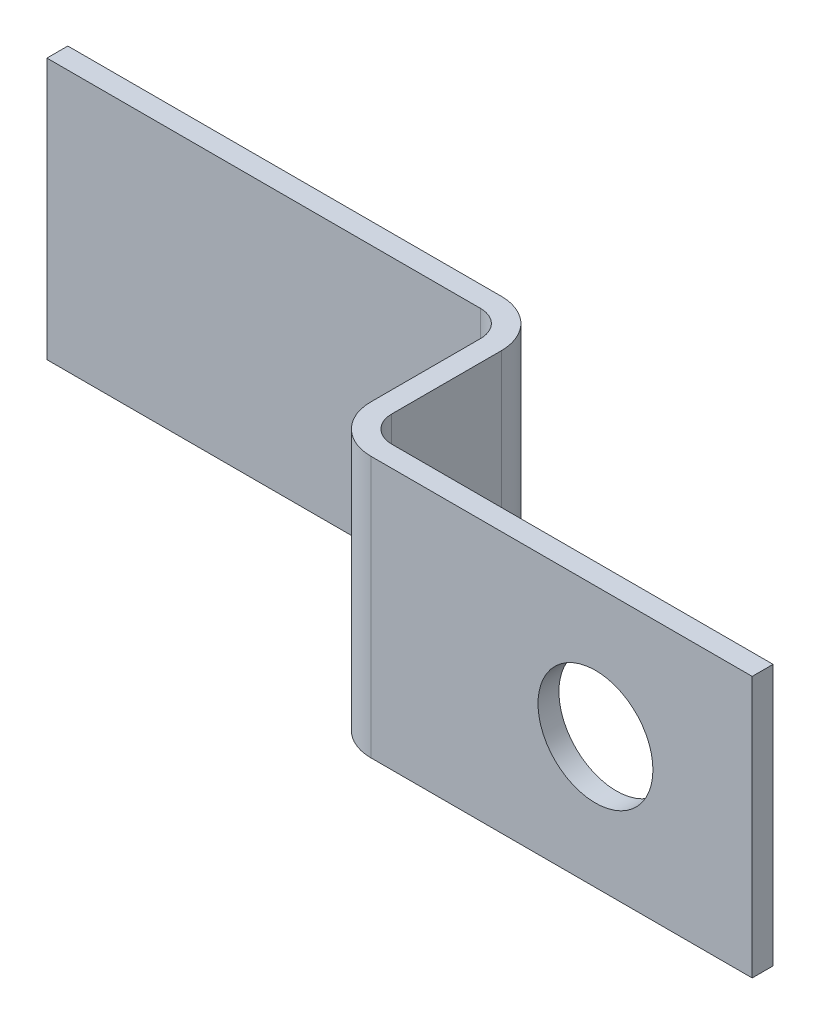
ISO-10303-21;
HEADER;
FILE_DESCRIPTION(('STEP AP214'),'2;1');
FILE_NAME('part.step','',(''),(''),'','','');
FILE_SCHEMA(('AUTOMOTIVE_DESIGN { 1 0 10303 214 1 1 1 1 }'));
ENDSEC;
DATA;
#1=APPLICATION_CONTEXT('core data for automotive mechanical design processes');
#2=APPLICATION_PROTOCOL_DEFINITION('international standard','automotive_design',2000,#1);
#3=PRODUCT_CONTEXT('',#1,'mechanical');
#4=PRODUCT('Part','Part','',(#3));
#5=PRODUCT_RELATED_PRODUCT_CATEGORY('part','',(#4));
#6=PRODUCT_DEFINITION_FORMATION('','',#4);
#7=PRODUCT_DEFINITION_CONTEXT('part definition',#1,'design');
#8=PRODUCT_DEFINITION('design','',#6,#7);
#9=PRODUCT_DEFINITION_SHAPE('','',#8);
#10=(LENGTH_UNIT() NAMED_UNIT(*) SI_UNIT(.MILLI.,.METRE.));
#11=(NAMED_UNIT(*) PLANE_ANGLE_UNIT() SI_UNIT($,.RADIAN.));
#12=(NAMED_UNIT(*) SI_UNIT($,.STERADIAN.) SOLID_ANGLE_UNIT());
#13=UNCERTAINTY_MEASURE_WITH_UNIT(LENGTH_MEASURE(1.E-05),#10,'distance_accuracy_value','');
#14=(GEOMETRIC_REPRESENTATION_CONTEXT(3) GLOBAL_UNCERTAINTY_ASSIGNED_CONTEXT((#13)) GLOBAL_UNIT_ASSIGNED_CONTEXT((#10,
#11,#12)) REPRESENTATION_CONTEXT('',''));
#15=CARTESIAN_POINT('',(0.,0.,0.));
#16=DIRECTION('',(0.,0.,1.));
#17=DIRECTION('',(1.,0.,0.));
#18=AXIS2_PLACEMENT_3D('',#15,#16,#17);
#19=CARTESIAN_POINT('',(-27.4626472495789,-5.,-3.31523835920205));
#20=DIRECTION('',(1.,0.,0.));
#21=DIRECTION('',(0.,0.,-1.));
#22=AXIS2_PLACEMENT_3D('',#19,#20,#21);
#23=PLANE('',#22);
#24=DIRECTION('',(0.,1.,0.));
#25=VECTOR('',#24,1.);
#26=CARTESIAN_POINT('',(-27.4626472495789,-5.,3.68476164079796));
#27=LINE('',#26,#25);
#28=CARTESIAN_POINT('',(-27.4626472495789,-5.,3.68476164079796));
#29=VERTEX_POINT('',#28);
#30=CARTESIAN_POINT('',(-27.4626472495789,5.,3.68476164079796));
#31=VERTEX_POINT('',#30);
#32=EDGE_CURVE('E210',#29,#31,#27,.T.);
#33=ORIENTED_EDGE('',*,*,#32,.T.);
#34=DIRECTION('',(0.,0.,1.));
#35=VECTOR('',#34,1.);
#36=CARTESIAN_POINT('',(-27.4626472495789,5.,-3.31523835920205));
#37=LINE('',#36,#35);
#38=CARTESIAN_POINT('',(-27.4626472495789,5.,4.48476164079796));
#39=VERTEX_POINT('',#38);
#40=EDGE_CURVE('E151',#31,#39,#37,.T.);
#41=ORIENTED_EDGE('',*,*,#40,.T.);
#42=DIRECTION('',(0.,1.,0.));
#43=VECTOR('',#42,1.);
#44=CARTESIAN_POINT('',(-27.4626472495789,-5.,4.48476164079796));
#45=LINE('',#44,#43);
#46=CARTESIAN_POINT('',(-27.4626472495789,-5.,4.48476164079796));
#47=VERTEX_POINT('',#46);
#48=EDGE_CURVE('E215',#47,#39,#45,.T.);
#49=ORIENTED_EDGE('',*,*,#48,.F.);
#50=DIRECTION('',(0.,0.,1.));
#51=VECTOR('',#50,1.);
#52=CARTESIAN_POINT('',(-27.4626472495789,-5.,-3.31523835920205));
#53=LINE('',#52,#51);
#54=EDGE_CURVE('E145',#29,#47,#53,.T.);
#55=ORIENTED_EDGE('',*,*,#54,.F.);
#56=EDGE_LOOP('',(#33,#41,#49,#55));
#57=FACE_BOUND('',#56,.T.);
#58=ADVANCED_FACE('F30',(#57),#23,.T.);
#59=CARTESIAN_POINT('',(-61.4626472495789,-5.,-3.31523835920205));
#60=DIRECTION('',(0.,-1.,0.));
#61=DIRECTION('',(0.,0.,-1.));
#62=AXIS2_PLACEMENT_3D('',#59,#60,#61);
#63=PLANE('',#62);
#64=DIRECTION('',(1.,0.,0.));
#65=VECTOR('',#64,1.);
#66=CARTESIAN_POINT('',(-61.4626472495789,-5.,4.48476164079796));
#67=LINE('',#66,#65);
#68=CARTESIAN_POINT('',(-42.0626472495789,-5.,4.48476164079796));
#69=VERTEX_POINT('',#68);
#70=EDGE_CURVE('E218',#69,#47,#67,.T.);
#71=ORIENTED_EDGE('',*,*,#70,.F.);
#72=CARTESIAN_POINT('',(-42.0626472495789,-5.,2.68476164079796));
#73=DIRECTION('',(0.,-1.,0.));
#74=DIRECTION('',(0.,0.,-1.));
#75=AXIS2_PLACEMENT_3D('',#72,#73,#74);
#76=CIRCLE('',#75,1.8);
#77=CARTESIAN_POINT('',(-43.8626472495789,-5.,2.68476164079796));
#78=VERTEX_POINT('',#77);
#79=EDGE_CURVE('E11',#69,#78,#76,.T.);
#80=ORIENTED_EDGE('',*,*,#79,.T.);
#81=DIRECTION('',(0.,0.,-1.));
#82=VECTOR('',#81,1.);
#83=CARTESIAN_POINT('',(-43.8626472495789,-5.,4.48476164079796));
#84=LINE('',#83,#82);
#85=CARTESIAN_POINT('',(-43.8626472495789,-5.,-1.51523835920204));
#86=VERTEX_POINT('',#85);
#87=EDGE_CURVE('E130',#78,#86,#84,.T.);
#88=ORIENTED_EDGE('',*,*,#87,.T.);
#89=CARTESIAN_POINT('',(-44.8626472495789,-5.,-1.51523835920204));
#90=DIRECTION('',(0.,-1.,0.));
#91=DIRECTION('',(0.,0.,-1.));
#92=AXIS2_PLACEMENT_3D('',#89,#90,#91);
#93=CIRCLE('',#92,1.);
#94=CARTESIAN_POINT('',(-44.8626472495789,-5.,-2.51523835920204));
#95=VERTEX_POINT('',#94);
#96=EDGE_CURVE('E125',#86,#95,#93,.F.);
#97=ORIENTED_EDGE('',*,*,#96,.T.);
#98=DIRECTION('',(-1.,0.,0.));
#99=VECTOR('',#98,1.);
#100=CARTESIAN_POINT('',(-43.8626472495789,-5.,-2.51523835920204));
#101=LINE('',#100,#99);
#102=CARTESIAN_POINT('',(-61.4626472495789,-5.,-2.51523835920204));
#103=VERTEX_POINT('',#102);
#104=EDGE_CURVE('E117',#95,#103,#101,.T.);
#105=ORIENTED_EDGE('',*,*,#104,.T.);
#106=DIRECTION('',(0.,0.,1.));
#107=VECTOR('',#106,1.);
#108=CARTESIAN_POINT('',(-61.4626472495789,-5.,-3.31523835920205));
#109=LINE('',#108,#107);
#110=CARTESIAN_POINT('',(-61.4626472495789,-5.,-3.31523835920205));
#111=VERTEX_POINT('',#110);
#112=EDGE_CURVE('E122',#111,#103,#109,.T.);
#113=ORIENTED_EDGE('',*,*,#112,.F.);
#114=DIRECTION('',(1.,0.,0.));
#115=VECTOR('',#114,1.);
#116=CARTESIAN_POINT('',(-61.4626472495789,-5.,-3.31523835920205));
#117=LINE('',#116,#115);
#118=CARTESIAN_POINT('',(-44.8626472495789,-5.,-3.31523835920205));
#119=VERTEX_POINT('',#118);
#120=EDGE_CURVE('E156',#111,#119,#117,.T.);
#121=ORIENTED_EDGE('',*,*,#120,.T.);
#122=CARTESIAN_POINT('',(-44.8626472495789,-5.,-1.51523835920205));
#123=DIRECTION('',(0.,-1.,0.));
#124=DIRECTION('',(0.,0.,-1.));
#125=AXIS2_PLACEMENT_3D('',#122,#123,#124);
#126=CIRCLE('',#125,1.8);
#127=CARTESIAN_POINT('',(-43.0626472495789,-5.,-1.51523835920205));
#128=VERTEX_POINT('',#127);
#129=EDGE_CURVE('E183',#119,#128,#126,.T.);
#130=ORIENTED_EDGE('',*,*,#129,.T.);
#131=DIRECTION('',(0.,0.,1.));
#132=VECTOR('',#131,1.);
#133=CARTESIAN_POINT('',(-43.0626472495789,-5.,-3.31523835920204));
#134=LINE('',#133,#132);
#135=CARTESIAN_POINT('',(-43.0626472495789,-5.,2.68476164079796));
#136=VERTEX_POINT('',#135);
#137=EDGE_CURVE('E205',#128,#136,#134,.T.);
#138=ORIENTED_EDGE('',*,*,#137,.T.);
#139=CARTESIAN_POINT('',(-42.0626472495789,-5.,2.68476164079796));
#140=DIRECTION('',(0.,-1.,0.));
#141=DIRECTION('',(0.,0.,-1.));
#142=AXIS2_PLACEMENT_3D('',#139,#140,#141);
#143=CIRCLE('',#142,1.);
#144=CARTESIAN_POINT('',(-42.0626472495789,-5.,3.68476164079796));
#145=VERTEX_POINT('',#144);
#146=EDGE_CURVE('E165',#136,#145,#143,.F.);
#147=ORIENTED_EDGE('',*,*,#146,.T.);
#148=DIRECTION('',(1.,0.,0.));
#149=VECTOR('',#148,1.);
#150=CARTESIAN_POINT('',(-43.0626472495789,-5.,3.68476164079796));
#151=LINE('',#150,#149);
#152=EDGE_CURVE('E207',#145,#29,#151,.T.);
#153=ORIENTED_EDGE('',*,*,#152,.T.);
#154=ORIENTED_EDGE('',*,*,#54,.T.);
#155=EDGE_LOOP('',(#71,#80,#88,#97,#105,#113,#121,#130,#138,#147,#153,#154));
#156=FACE_BOUND('',#155,.T.);
#157=ADVANCED_FACE('F119',(#156),#63,.T.);
#158=CARTESIAN_POINT('',(-61.4626472495789,5.,-3.31523835920205));
#159=DIRECTION('',(-1.,0.,0.));
#160=DIRECTION('',(0.,0.,1.));
#161=AXIS2_PLACEMENT_3D('',#158,#159,#160);
#162=PLANE('',#161);
#163=DIRECTION('',(0.,1.,0.));
#164=VECTOR('',#163,1.);
#165=CARTESIAN_POINT('',(-61.4626472495789,-5.,-2.51523835920204));
#166=LINE('',#165,#164);
#167=CARTESIAN_POINT('',(-61.4626472495789,5.,-2.51523835920204));
#168=VERTEX_POINT('',#167);
#169=EDGE_CURVE('E129',#103,#168,#166,.T.);
#170=ORIENTED_EDGE('',*,*,#169,.T.);
#171=DIRECTION('',(0.,0.,1.));
#172=VECTOR('',#171,1.);
#173=CARTESIAN_POINT('',(-61.4626472495789,5.,-3.31523835920205));
#174=LINE('',#173,#172);
#175=CARTESIAN_POINT('',(-61.4626472495789,5.,-3.31523835920205));
#176=VERTEX_POINT('',#175);
#177=EDGE_CURVE('E146',#176,#168,#174,.T.);
#178=ORIENTED_EDGE('',*,*,#177,.F.);
#179=DIRECTION('',(0.,-1.,0.));
#180=VECTOR('',#179,1.);
#181=CARTESIAN_POINT('',(-61.4626472495789,5.,-3.31523835920205));
#182=LINE('',#181,#180);
#183=EDGE_CURVE('E143',#176,#111,#182,.T.);
#184=ORIENTED_EDGE('',*,*,#183,.T.);
#185=ORIENTED_EDGE('',*,*,#112,.T.);
#186=EDGE_LOOP('',(#170,#178,#184,#185));
#187=FACE_BOUND('',#186,.T.);
#188=ADVANCED_FACE('F141',(#187),#162,.T.);
#189=CARTESIAN_POINT('',(-27.4626472495789,5.,-3.31523835920205));
#190=DIRECTION('',(0.,1.,0.));
#191=DIRECTION('',(0.,0.,1.));
#192=AXIS2_PLACEMENT_3D('',#189,#190,#191);
#193=PLANE('',#192);
#194=DIRECTION('',(0.,0.,-1.));
#195=VECTOR('',#194,1.);
#196=CARTESIAN_POINT('',(-43.8626472495789,5.,4.48476164079796));
#197=LINE('',#196,#195);
#198=CARTESIAN_POINT('',(-43.8626472495789,5.,2.68476164079796));
#199=VERTEX_POINT('',#198);
#200=CARTESIAN_POINT('',(-43.8626472495789,5.,-1.51523835920204));
#201=VERTEX_POINT('',#200);
#202=EDGE_CURVE('E192',#199,#201,#197,.T.);
#203=ORIENTED_EDGE('',*,*,#202,.F.);
#204=CARTESIAN_POINT('',(-42.0626472495789,5.,2.68476164079796));
#205=DIRECTION('',(0.,1.,0.));
#206=DIRECTION('',(0.,0.,1.));
#207=AXIS2_PLACEMENT_3D('',#204,#205,#206);
#208=CIRCLE('',#207,1.8);
#209=CARTESIAN_POINT('',(-42.0626472495789,5.,4.48476164079796));
#210=VERTEX_POINT('',#209);
#211=EDGE_CURVE('E52',#199,#210,#208,.T.);
#212=ORIENTED_EDGE('',*,*,#211,.T.);
#213=DIRECTION('',(-1.,0.,0.));
#214=VECTOR('',#213,1.);
#215=CARTESIAN_POINT('',(-27.4626472495789,5.,4.48476164079796));
#216=LINE('',#215,#214);
#217=EDGE_CURVE('E223',#39,#210,#216,.T.);
#218=ORIENTED_EDGE('',*,*,#217,.F.);
#219=ORIENTED_EDGE('',*,*,#40,.F.);
#220=DIRECTION('',(1.,0.,0.));
#221=VECTOR('',#220,1.);
#222=CARTESIAN_POINT('',(-43.0626472495789,5.,3.68476164079796));
#223=LINE('',#222,#221);
#224=CARTESIAN_POINT('',(-42.0626472495789,5.,3.68476164079796));
#225=VERTEX_POINT('',#224);
#226=EDGE_CURVE('E208',#225,#31,#223,.T.);
#227=ORIENTED_EDGE('',*,*,#226,.F.);
#228=CARTESIAN_POINT('',(-42.0626472495789,5.,2.68476164079796));
#229=DIRECTION('',(0.,1.,0.));
#230=DIRECTION('',(0.,0.,1.));
#231=AXIS2_PLACEMENT_3D('',#228,#229,#230);
#232=CIRCLE('',#231,1.);
#233=CARTESIAN_POINT('',(-43.0626472495789,5.,2.68476164079796));
#234=VERTEX_POINT('',#233);
#235=EDGE_CURVE('E162',#225,#234,#232,.F.);
#236=ORIENTED_EDGE('',*,*,#235,.T.);
#237=DIRECTION('',(0.,0.,1.));
#238=VECTOR('',#237,1.);
#239=CARTESIAN_POINT('',(-43.0626472495789,5.,-3.31523835920204));
#240=LINE('',#239,#238);
#241=CARTESIAN_POINT('',(-43.0626472495789,5.,-1.51523835920205));
#242=VERTEX_POINT('',#241);
#243=EDGE_CURVE('E139',#242,#234,#240,.T.);
#244=ORIENTED_EDGE('',*,*,#243,.F.);
#245=CARTESIAN_POINT('',(-44.8626472495789,5.,-1.51523835920205));
#246=DIRECTION('',(0.,1.,0.));
#247=DIRECTION('',(0.,0.,1.));
#248=AXIS2_PLACEMENT_3D('',#245,#246,#247);
#249=CIRCLE('',#248,1.8);
#250=CARTESIAN_POINT('',(-44.8626472495789,5.,-3.31523835920205));
#251=VERTEX_POINT('',#250);
#252=EDGE_CURVE('E179',#242,#251,#249,.T.);
#253=ORIENTED_EDGE('',*,*,#252,.T.);
#254=DIRECTION('',(-1.,0.,0.));
#255=VECTOR('',#254,1.);
#256=CARTESIAN_POINT('',(-27.4626472495789,5.,-3.31523835920205));
#257=LINE('',#256,#255);
#258=EDGE_CURVE('E216',#251,#176,#257,.T.);
#259=ORIENTED_EDGE('',*,*,#258,.T.);
#260=ORIENTED_EDGE('',*,*,#177,.T.);
#261=DIRECTION('',(-1.,0.,0.));
#262=VECTOR('',#261,1.);
#263=CARTESIAN_POINT('',(-43.8626472495789,5.,-2.51523835920204));
#264=LINE('',#263,#262);
#265=CARTESIAN_POINT('',(-44.8626472495789,5.,-2.51523835920204));
#266=VERTEX_POINT('',#265);
#267=EDGE_CURVE('E135',#266,#168,#264,.T.);
#268=ORIENTED_EDGE('',*,*,#267,.F.);
#269=CARTESIAN_POINT('',(-44.8626472495789,5.,-1.51523835920204));
#270=DIRECTION('',(0.,1.,0.));
#271=DIRECTION('',(0.,0.,1.));
#272=AXIS2_PLACEMENT_3D('',#269,#270,#271);
#273=CIRCLE('',#272,1.);
#274=EDGE_CURVE('E172',#266,#201,#273,.F.);
#275=ORIENTED_EDGE('',*,*,#274,.T.);
#276=EDGE_LOOP('',(#203,#212,#218,#219,#227,#236,#244,#253,#259,#260,#268,#275));
#277=FACE_BOUND('',#276,.T.);
#278=ADVANCED_FACE('F195',(#277),#193,.T.);
#279=CARTESIAN_POINT('',(-27.4626472495789,5.,-3.31523835920205));
#280=DIRECTION('',(0.,0.,1.));
#281=DIRECTION('',(1.,0.,0.));
#282=AXIS2_PLACEMENT_3D('',#279,#280,#281);
#283=PLANE('',#282);
#284=ORIENTED_EDGE('',*,*,#258,.F.);
#285=DIRECTION('',(0.,1.,0.));
#286=VECTOR('',#285,1.);
#287=CARTESIAN_POINT('',(-44.8626472495789,5.,-3.31523835920205));
#288=LINE('',#287,#286);
#289=EDGE_CURVE('E181',#251,#119,#288,.F.);
#290=ORIENTED_EDGE('',*,*,#289,.T.);
#291=ORIENTED_EDGE('',*,*,#120,.F.);
#292=ORIENTED_EDGE('',*,*,#183,.F.);
#293=EDGE_LOOP('',(#284,#290,#291,#292));
#294=FACE_BOUND('',#293,.T.);
#295=ADVANCED_FACE('F236',(#294),#283,.F.);
#296=CARTESIAN_POINT('',(-27.4626472495789,5.,4.48476164079796));
#297=DIRECTION('',(0.,0.,1.));
#298=DIRECTION('',(1.,0.,0.));
#299=AXIS2_PLACEMENT_3D('',#296,#297,#298);
#300=PLANE('',#299);
#301=CARTESIAN_POINT('',(-33.4626472495789,0.,4.48476164079796));
#302=DIRECTION('',(0.,0.,1.));
#303=DIRECTION('',(1.,0.,0.));
#304=AXIS2_PLACEMENT_3D('',#301,#302,#303);
#305=CIRCLE('',#304,2.20000000000001);
#306=CARTESIAN_POINT('',(-31.2626472495789,0.,4.48476164079796));
#307=VERTEX_POINT('',#306);
#308=EDGE_CURVE('E201',#307,#307,#305,.T.);
#309=ORIENTED_EDGE('',*,*,#308,.F.);
#310=EDGE_LOOP('',(#309));
#311=FACE_BOUND('',#310,.T.);
#312=ORIENTED_EDGE('',*,*,#217,.T.);
#313=DIRECTION('',(0.,1.,0.));
#314=VECTOR('',#313,1.);
#315=CARTESIAN_POINT('',(-42.0626472495789,-5.,4.48476164079796));
#316=LINE('',#315,#314);
#317=EDGE_CURVE('E38',#210,#69,#316,.F.);
#318=ORIENTED_EDGE('',*,*,#317,.T.);
#319=ORIENTED_EDGE('',*,*,#70,.T.);
#320=ORIENTED_EDGE('',*,*,#48,.T.);
#321=EDGE_LOOP('',(#312,#318,#319,#320));
#322=FACE_BOUND('',#321,.T.);
#323=ADVANCED_FACE('F224',(#311,#322),#300,.T.);
#324=CARTESIAN_POINT('',(-43.0626472495789,-5.,3.68476164079796));
#325=DIRECTION('',(0.,0.,1.));
#326=DIRECTION('',(1.,0.,0.));
#327=AXIS2_PLACEMENT_3D('',#324,#325,#326);
#328=PLANE('',#327);
#329=CARTESIAN_POINT('',(-33.4626472495789,0.,3.68476164079796));
#330=DIRECTION('',(0.,0.,1.));
#331=DIRECTION('',(1.,0.,0.));
#332=AXIS2_PLACEMENT_3D('',#329,#330,#331);
#333=CIRCLE('',#332,2.20000000000001);
#334=CARTESIAN_POINT('',(-31.2626472495789,0.,3.68476164079796));
#335=VERTEX_POINT('',#334);
#336=EDGE_CURVE('E197',#335,#335,#333,.T.);
#337=ORIENTED_EDGE('',*,*,#336,.T.);
#338=EDGE_LOOP('',(#337));
#339=FACE_BOUND('',#338,.T.);
#340=ORIENTED_EDGE('',*,*,#152,.F.);
#341=DIRECTION('',(0.,1.,0.));
#342=VECTOR('',#341,1.);
#343=CARTESIAN_POINT('',(-42.0626472495789,5.,3.68476164079796));
#344=LINE('',#343,#342);
#345=EDGE_CURVE('E149',#145,#225,#344,.T.);
#346=ORIENTED_EDGE('',*,*,#345,.T.);
#347=ORIENTED_EDGE('',*,*,#226,.T.);
#348=ORIENTED_EDGE('',*,*,#32,.F.);
#349=EDGE_LOOP('',(#340,#346,#347,#348));
#350=FACE_BOUND('',#349,.T.);
#351=ADVANCED_FACE('F252',(#339,#350),#328,.F.);
#352=CARTESIAN_POINT('',(-43.0626472495789,-5.,-3.31523835920204));
#353=DIRECTION('',(-1.,0.,0.));
#354=DIRECTION('',(0.,0.,1.));
#355=AXIS2_PLACEMENT_3D('',#352,#353,#354);
#356=PLANE('',#355);
#357=ORIENTED_EDGE('',*,*,#137,.F.);
#358=DIRECTION('',(0.,1.,0.));
#359=VECTOR('',#358,1.);
#360=CARTESIAN_POINT('',(-43.0626472495789,-5.,-1.51523835920205));
#361=LINE('',#360,#359);
#362=EDGE_CURVE('E176',#128,#242,#361,.T.);
#363=ORIENTED_EDGE('',*,*,#362,.T.);
#364=ORIENTED_EDGE('',*,*,#243,.T.);
#365=DIRECTION('',(0.,1.,0.));
#366=VECTOR('',#365,1.);
#367=CARTESIAN_POINT('',(-43.0626472495789,-5.,2.68476164079796));
#368=LINE('',#367,#366);
#369=EDGE_CURVE('E159',#234,#136,#368,.F.);
#370=ORIENTED_EDGE('',*,*,#369,.T.);
#371=EDGE_LOOP('',(#357,#363,#364,#370));
#372=FACE_BOUND('',#371,.T.);
#373=ADVANCED_FACE('F245',(#372),#356,.F.);
#374=CARTESIAN_POINT('',(-43.8626472495789,-5.,-2.51523835920204));
#375=DIRECTION('',(0.,0.,-1.));
#376=DIRECTION('',(-1.,0.,0.));
#377=AXIS2_PLACEMENT_3D('',#374,#375,#376);
#378=PLANE('',#377);
#379=ORIENTED_EDGE('',*,*,#104,.F.);
#380=DIRECTION('',(0.,1.,0.));
#381=VECTOR('',#380,1.);
#382=CARTESIAN_POINT('',(-44.8626472495789,5.,-2.51523835920204));
#383=LINE('',#382,#381);
#384=EDGE_CURVE('E167',#95,#266,#383,.T.);
#385=ORIENTED_EDGE('',*,*,#384,.T.);
#386=ORIENTED_EDGE('',*,*,#267,.T.);
#387=ORIENTED_EDGE('',*,*,#169,.F.);
#388=EDGE_LOOP('',(#379,#385,#386,#387));
#389=FACE_BOUND('',#388,.T.);
#390=ADVANCED_FACE('F133',(#389),#378,.F.);
#391=CARTESIAN_POINT('',(-43.8626472495789,-5.,4.48476164079796));
#392=DIRECTION('',(1.,0.,0.));
#393=DIRECTION('',(0.,0.,-1.));
#394=AXIS2_PLACEMENT_3D('',#391,#392,#393);
#395=PLANE('',#394);
#396=ORIENTED_EDGE('',*,*,#87,.F.);
#397=DIRECTION('',(0.,1.,0.));
#398=VECTOR('',#397,1.);
#399=CARTESIAN_POINT('',(-43.8626472495789,5.,2.68476164079796));
#400=LINE('',#399,#398);
#401=EDGE_CURVE('E185',#78,#199,#400,.T.);
#402=ORIENTED_EDGE('',*,*,#401,.T.);
#403=ORIENTED_EDGE('',*,*,#202,.T.);
#404=DIRECTION('',(0.,1.,0.));
#405=VECTOR('',#404,1.);
#406=CARTESIAN_POINT('',(-43.8626472495789,-5.,-1.51523835920204));
#407=LINE('',#406,#405);
#408=EDGE_CURVE('E169',#201,#86,#407,.F.);
#409=ORIENTED_EDGE('',*,*,#408,.T.);
#410=EDGE_LOOP('',(#396,#402,#403,#409));
#411=FACE_BOUND('',#410,.T.);
#412=ADVANCED_FACE('F191',(#411),#395,.F.);
#413=CARTESIAN_POINT('',(-33.4626472495789,0.,4.48476164079796));
#414=DIRECTION('',(0.,0.,1.));
#415=DIRECTION('',(1.,0.,0.));
#416=AXIS2_PLACEMENT_3D('',#413,#414,#415);
#417=CYLINDRICAL_SURFACE('',#416,2.20000000000001);
#418=ORIENTED_EDGE('',*,*,#308,.T.);
#419=EDGE_LOOP('',(#418));
#420=FACE_BOUND('',#419,.T.);
#421=ORIENTED_EDGE('',*,*,#336,.F.);
#422=EDGE_LOOP('',(#421));
#423=FACE_BOUND('',#422,.T.);
#424=ADVANCED_FACE('F275',(#420,#423),#417,.F.);
#425=CARTESIAN_POINT('',(-42.0626472495789,-5.,2.68476164079796));
#426=DIRECTION('',(0.,-1.,0.));
#427=DIRECTION('',(0.,0.,-1.));
#428=AXIS2_PLACEMENT_3D('',#425,#426,#427);
#429=CYLINDRICAL_SURFACE('',#428,1.);
#430=ORIENTED_EDGE('',*,*,#146,.F.);
#431=ORIENTED_EDGE('',*,*,#369,.F.);
#432=ORIENTED_EDGE('',*,*,#235,.F.);
#433=ORIENTED_EDGE('',*,*,#345,.F.);
#434=EDGE_LOOP('',(#430,#431,#432,#433));
#435=FACE_BOUND('',#434,.T.);
#436=ADVANCED_FACE('F250',(#435),#429,.F.);
#437=CARTESIAN_POINT('',(-44.8626472495789,-5.,-1.51523835920204));
#438=DIRECTION('',(0.,-1.,0.));
#439=DIRECTION('',(0.,0.,-1.));
#440=AXIS2_PLACEMENT_3D('',#437,#438,#439);
#441=CYLINDRICAL_SURFACE('',#440,1.);
#442=ORIENTED_EDGE('',*,*,#96,.F.);
#443=ORIENTED_EDGE('',*,*,#408,.F.);
#444=ORIENTED_EDGE('',*,*,#274,.F.);
#445=ORIENTED_EDGE('',*,*,#384,.F.);
#446=EDGE_LOOP('',(#442,#443,#444,#445));
#447=FACE_BOUND('',#446,.T.);
#448=ADVANCED_FACE('F233',(#447),#441,.F.);
#449=CARTESIAN_POINT('',(-44.8626472495789,-5.,-1.51523835920205));
#450=DIRECTION('',(0.,1.,0.));
#451=DIRECTION('',(0.,0.,1.));
#452=AXIS2_PLACEMENT_3D('',#449,#450,#451);
#453=CYLINDRICAL_SURFACE('',#452,1.8);
#454=ORIENTED_EDGE('',*,*,#129,.F.);
#455=ORIENTED_EDGE('',*,*,#289,.F.);
#456=ORIENTED_EDGE('',*,*,#252,.F.);
#457=ORIENTED_EDGE('',*,*,#362,.F.);
#458=EDGE_LOOP('',(#454,#455,#456,#457));
#459=FACE_BOUND('',#458,.T.);
#460=ADVANCED_FACE('F242',(#459),#453,.T.);
#461=CARTESIAN_POINT('',(-42.0626472495789,-5.,2.68476164079796));
#462=DIRECTION('',(0.,-1.,0.));
#463=DIRECTION('',(0.,0.,-1.));
#464=AXIS2_PLACEMENT_3D('',#461,#462,#463);
#465=CYLINDRICAL_SURFACE('',#464,1.8);
#466=ORIENTED_EDGE('',*,*,#79,.F.);
#467=ORIENTED_EDGE('',*,*,#317,.F.);
#468=ORIENTED_EDGE('',*,*,#211,.F.);
#469=ORIENTED_EDGE('',*,*,#401,.F.);
#470=EDGE_LOOP('',(#466,#467,#468,#469));
#471=FACE_BOUND('',#470,.T.);
#472=ADVANCED_FACE('F32',(#471),#465,.T.);
#473=CLOSED_SHELL('',(#58,#157,#188,#278,#295,#323,#351,#373,#390,#412,#424,#436,#448,#460,#472));
#474=MANIFOLD_SOLID_BREP('B2',#473);
#475=ADVANCED_BREP_SHAPE_REPRESENTATION('',(#18,#474),#14);
#476=SHAPE_DEFINITION_REPRESENTATION(#9,#475);
ENDSEC;
END-ISO-10303-21;
